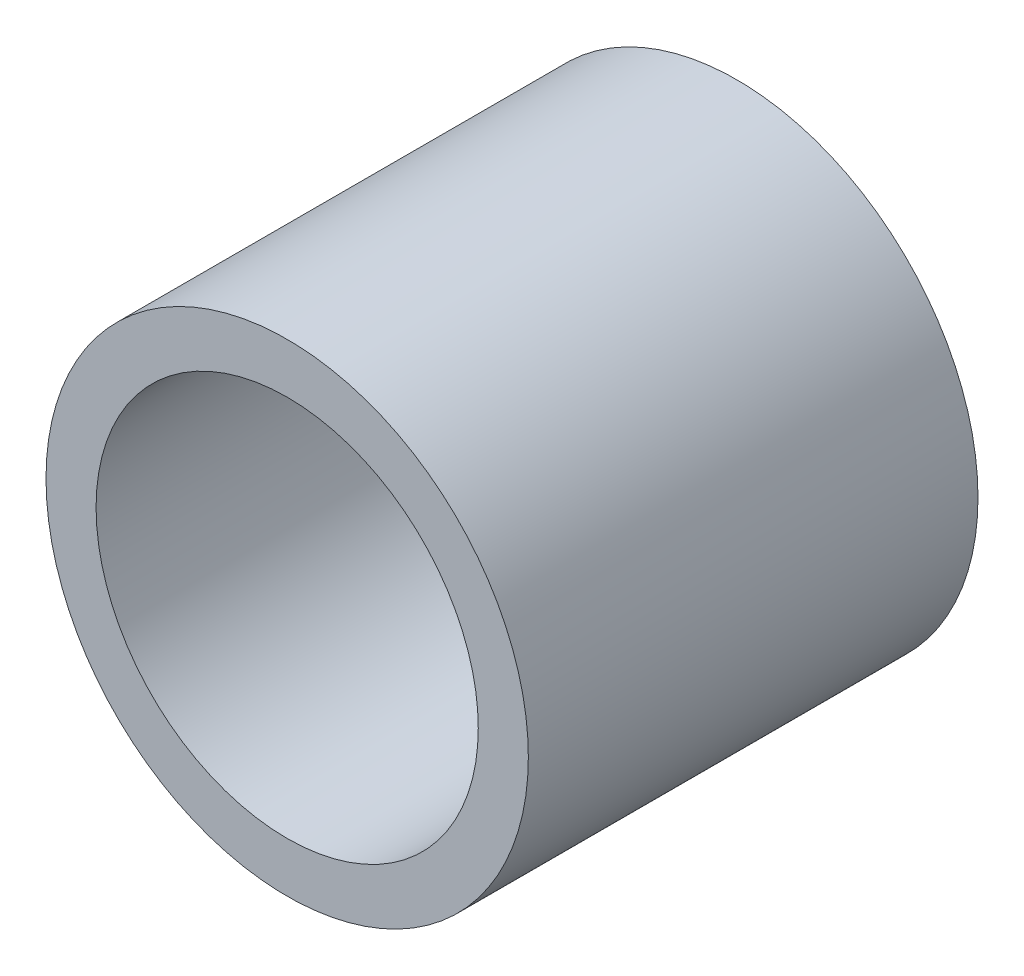
ISO-10303-21;
HEADER;
FILE_DESCRIPTION(('STEP AP214'),'2;1');
FILE_NAME('part.step','',(''),(''),'','','');
FILE_SCHEMA(('AUTOMOTIVE_DESIGN { 1 0 10303 214 1 1 1 1 }'));
ENDSEC;
DATA;
#1=APPLICATION_CONTEXT('core data for automotive mechanical design processes');
#2=APPLICATION_PROTOCOL_DEFINITION('international standard','automotive_design',2000,#1);
#3=PRODUCT_CONTEXT('',#1,'mechanical');
#4=PRODUCT('Part','Part','',(#3));
#5=PRODUCT_RELATED_PRODUCT_CATEGORY('part','',(#4));
#6=PRODUCT_DEFINITION_FORMATION('','',#4);
#7=PRODUCT_DEFINITION_CONTEXT('part definition',#1,'design');
#8=PRODUCT_DEFINITION('design','',#6,#7);
#9=PRODUCT_DEFINITION_SHAPE('','',#8);
#10=(LENGTH_UNIT() NAMED_UNIT(*) SI_UNIT(.MILLI.,.METRE.));
#11=(NAMED_UNIT(*) PLANE_ANGLE_UNIT() SI_UNIT($,.RADIAN.));
#12=(NAMED_UNIT(*) SI_UNIT($,.STERADIAN.) SOLID_ANGLE_UNIT());
#13=UNCERTAINTY_MEASURE_WITH_UNIT(LENGTH_MEASURE(1.E-05),#10,'distance_accuracy_value','');
#14=(GEOMETRIC_REPRESENTATION_CONTEXT(3) GLOBAL_UNCERTAINTY_ASSIGNED_CONTEXT((#13)) GLOBAL_UNIT_ASSIGNED_CONTEXT((#10,
#11,#12)) REPRESENTATION_CONTEXT('',''));
#15=CARTESIAN_POINT('',(0.,0.,0.));
#16=DIRECTION('',(0.,0.,1.));
#17=DIRECTION('',(1.,0.,0.));
#18=AXIS2_PLACEMENT_3D('',#15,#16,#17);
#19=CARTESIAN_POINT('',(0.,0.,30.988));
#20=DIRECTION('',(0.,0.,-1.));
#21=DIRECTION('',(-1.,0.,0.));
#22=AXIS2_PLACEMENT_3D('',#19,#20,#21);
#23=CYLINDRICAL_SURFACE('',#22,14.986);
#24=CARTESIAN_POINT('',(0.,0.,0.));
#25=DIRECTION('',(0.,0.,1.));
#26=DIRECTION('',(1.,0.,0.));
#27=AXIS2_PLACEMENT_3D('',#24,#25,#26);
#28=CIRCLE('',#27,14.986);
#29=CARTESIAN_POINT('',(14.986,0.,0.));
#30=VERTEX_POINT('',#29);
#31=EDGE_CURVE('E10',#30,#30,#28,.T.);
#32=ORIENTED_EDGE('',*,*,#31,.T.);
#33=EDGE_LOOP('',(#32));
#34=FACE_BOUND('',#33,.T.);
#35=CARTESIAN_POINT('',(0.,0.,27.94));
#36=DIRECTION('',(0.,0.,1.));
#37=DIRECTION('',(1.,0.,0.));
#38=AXIS2_PLACEMENT_3D('',#35,#36,#37);
#39=CIRCLE('',#38,14.986);
#40=CARTESIAN_POINT('',(14.986,0.,27.94));
#41=VERTEX_POINT('',#40);
#42=EDGE_CURVE('E47',#41,#41,#39,.T.);
#43=ORIENTED_EDGE('',*,*,#42,.F.);
#44=EDGE_LOOP('',(#43));
#45=FACE_BOUND('',#44,.T.);
#46=ADVANCED_FACE('F37',(#34,#45),#23,.T.);
#47=CARTESIAN_POINT('',(0.,0.,0.));
#48=DIRECTION('',(0.,0.,1.));
#49=DIRECTION('',(1.,0.,0.));
#50=AXIS2_PLACEMENT_3D('',#47,#48,#49);
#51=PLANE('',#50);
#52=ORIENTED_EDGE('',*,*,#31,.F.);
#53=EDGE_LOOP('',(#52));
#54=FACE_BOUND('',#53,.T.);
#55=ADVANCED_FACE('F63',(#54),#51,.F.);
#56=CARTESIAN_POINT('',(0.,0.,27.94));
#57=DIRECTION('',(0.,0.,1.));
#58=DIRECTION('',(1.,0.,0.));
#59=AXIS2_PLACEMENT_3D('',#56,#57,#58);
#60=PLANE('',#59);
#61=CARTESIAN_POINT('',(0.,0.,27.94));
#62=DIRECTION('',(0.,0.,1.));
#63=DIRECTION('',(1.,0.,0.));
#64=AXIS2_PLACEMENT_3D('',#61,#62,#63);
#65=CIRCLE('',#64,11.8745);
#66=CARTESIAN_POINT('',(11.8745,0.,27.94));
#67=VERTEX_POINT('',#66);
#68=EDGE_CURVE('E51',#67,#67,#65,.T.);
#69=ORIENTED_EDGE('',*,*,#68,.F.);
#70=EDGE_LOOP('',(#69));
#71=FACE_BOUND('',#70,.T.);
#72=ORIENTED_EDGE('',*,*,#42,.T.);
#73=EDGE_LOOP('',(#72));
#74=FACE_BOUND('',#73,.T.);
#75=ADVANCED_FACE('F59',(#71,#74),#60,.T.);
#76=CARTESIAN_POINT('',(0.,0.,1.9558));
#77=DIRECTION('',(0.,0.,1.));
#78=DIRECTION('',(1.,0.,0.));
#79=AXIS2_PLACEMENT_3D('',#76,#77,#78);
#80=PLANE('',#79);
#81=CARTESIAN_POINT('',(0.,0.,1.9558));
#82=DIRECTION('',(0.,0.,1.));
#83=DIRECTION('',(1.,0.,0.));
#84=AXIS2_PLACEMENT_3D('',#81,#82,#83);
#85=CIRCLE('',#84,11.8745);
#86=CARTESIAN_POINT('',(11.8745,0.,1.9558));
#87=VERTEX_POINT('',#86);
#88=EDGE_CURVE('E43',#87,#87,#85,.T.);
#89=ORIENTED_EDGE('',*,*,#88,.T.);
#90=EDGE_LOOP('',(#89));
#91=FACE_BOUND('',#90,.T.);
#92=ADVANCED_FACE('F62',(#91),#80,.T.);
#93=CARTESIAN_POINT('',(0.,0.,1.9558));
#94=DIRECTION('',(0.,0.,1.));
#95=DIRECTION('',(1.,0.,0.));
#96=AXIS2_PLACEMENT_3D('',#93,#94,#95);
#97=CYLINDRICAL_SURFACE('',#96,11.8745);
#98=CARTESIAN_POINT('',(11.8745,0.,1.9558));
#99=CARTESIAN_POINT('',(11.8745,0.,2.22646875));
#100=CARTESIAN_POINT('',(11.8745,0.,2.4971375));
#101=CARTESIAN_POINT('',(11.8745,0.,3.038475));
#102=CARTESIAN_POINT('',(11.8745,0.,3.30914375));
#103=CARTESIAN_POINT('',(11.8745,0.,3.85048125));
#104=CARTESIAN_POINT('',(11.8745,0.,4.12115));
#105=CARTESIAN_POINT('',(11.8745,0.,4.6624875));
#106=CARTESIAN_POINT('',(11.8745,0.,4.93315625));
#107=CARTESIAN_POINT('',(11.8745,0.,5.47449375));
#108=CARTESIAN_POINT('',(11.8745,0.,5.7451625));
#109=CARTESIAN_POINT('',(11.8745,0.,6.2865));
#110=CARTESIAN_POINT('',(11.8745,0.,6.55716875));
#111=CARTESIAN_POINT('',(11.8745,0.,7.09850625));
#112=CARTESIAN_POINT('',(11.8745,0.,7.369175));
#113=CARTESIAN_POINT('',(11.8745,0.,7.9105125));
#114=CARTESIAN_POINT('',(11.8745,0.,8.18118125));
#115=CARTESIAN_POINT('',(11.8745,0.,8.72251875));
#116=CARTESIAN_POINT('',(11.8745,0.,8.9931875));
#117=CARTESIAN_POINT('',(11.8745,0.,9.534525));
#118=CARTESIAN_POINT('',(11.8745,0.,9.80519375));
#119=CARTESIAN_POINT('',(11.8745,0.,10.34653125));
#120=CARTESIAN_POINT('',(11.8745,0.,10.6172));
#121=CARTESIAN_POINT('',(11.8745,0.,11.1585375));
#122=CARTESIAN_POINT('',(11.8745,0.,11.42920625));
#123=CARTESIAN_POINT('',(11.8745,0.,11.97054375));
#124=CARTESIAN_POINT('',(11.8745,0.,12.2412125));
#125=CARTESIAN_POINT('',(11.8745,0.,12.78255));
#126=CARTESIAN_POINT('',(11.8745,0.,13.05321875));
#127=CARTESIAN_POINT('',(11.8745,0.,13.59455625));
#128=CARTESIAN_POINT('',(11.8745,0.,13.865225));
#129=CARTESIAN_POINT('',(11.8745,0.,14.4065625));
#130=CARTESIAN_POINT('',(11.8745,0.,14.67723125));
#131=CARTESIAN_POINT('',(11.8745,0.,15.21856875));
#132=CARTESIAN_POINT('',(11.8745,0.,15.4892375));
#133=CARTESIAN_POINT('',(11.8745,0.,16.030575));
#134=CARTESIAN_POINT('',(11.8745,0.,16.30124375));
#135=CARTESIAN_POINT('',(11.8745,0.,16.84258125));
#136=CARTESIAN_POINT('',(11.8745,0.,17.11325));
#137=CARTESIAN_POINT('',(11.8745,0.,17.6545875));
#138=CARTESIAN_POINT('',(11.8745,0.,17.92525625));
#139=CARTESIAN_POINT('',(11.8745,0.,18.46659375));
#140=CARTESIAN_POINT('',(11.8745,0.,18.7372625));
#141=CARTESIAN_POINT('',(11.8745,0.,19.2786));
#142=CARTESIAN_POINT('',(11.8745,0.,19.54926875));
#143=CARTESIAN_POINT('',(11.8745,0.,20.09060625));
#144=CARTESIAN_POINT('',(11.8745,0.,20.361275));
#145=CARTESIAN_POINT('',(11.8745,0.,20.9026125));
#146=CARTESIAN_POINT('',(11.8745,0.,21.17328125));
#147=CARTESIAN_POINT('',(11.8745,0.,21.71461875));
#148=CARTESIAN_POINT('',(11.8745,0.,21.9852875));
#149=CARTESIAN_POINT('',(11.8745,0.,22.526625));
#150=CARTESIAN_POINT('',(11.8745,0.,22.79729375));
#151=CARTESIAN_POINT('',(11.8745,0.,23.33863125));
#152=CARTESIAN_POINT('',(11.8745,0.,23.6093));
#153=CARTESIAN_POINT('',(11.8745,0.,24.1506375));
#154=CARTESIAN_POINT('',(11.8745,0.,24.42130625));
#155=CARTESIAN_POINT('',(11.8745,0.,24.96264375));
#156=CARTESIAN_POINT('',(11.8745,0.,25.2333125));
#157=CARTESIAN_POINT('',(11.8745,0.,25.77465));
#158=CARTESIAN_POINT('',(11.8745,0.,26.04531875));
#159=CARTESIAN_POINT('',(11.8745,0.,26.58665625));
#160=CARTESIAN_POINT('',(11.8745,0.,26.857325));
#161=CARTESIAN_POINT('',(11.8745,0.,27.3986625));
#162=CARTESIAN_POINT('',(11.8745,0.,27.66933125));
#163=CARTESIAN_POINT('',(11.8745,0.,27.94));
#164=B_SPLINE_CURVE_WITH_KNOTS('',3,(#98,#99,#100,#101,#102,#103,#104,#105,#106,#107,#108,#109,
#110,#111,#112,#113,#114,#115,#116,#117,#118,#119,#120,#121,#122,#123,#124,#125,#126,#127,#128,
#129,#130,#131,#132,#133,#134,#135,#136,#137,#138,#139,#140,#141,#142,#143,#144,#145,#146,#147,
#148,#149,#150,#151,#152,#153,#154,#155,#156,#157,#158,#159,#160,#161,#162,#163),.UNSPECIFIED.,
.F.,.F.,(4,2,2,2,2,2,2,2,2,2,2,2,2,2,2,2,2,2,2,2,2,2,2,2,2,2,2,2,2,2,2,2,4),(0.,0.81200625,
1.6240125,2.43601875,3.248025,4.06003125,4.8720375,5.68404375,6.49605,7.30805625,8.1200625,
8.93206875,9.744075,10.55608125,11.3680875,12.18009375,12.9921,13.80410625,14.6161125,
15.42811875,16.240125,17.05213125,17.8641375,18.67614375,19.48815,20.30015625,21.1121625,
21.92416875,22.736175,23.54818125,24.3601875,25.17219375,25.9842),.UNSPECIFIED.);
#165=EDGE_CURVE('BSEAM57',#87,#67,#164,.T.);
#166=ORIENTED_EDGE('',*,*,#88,.F.);
#167=ORIENTED_EDGE('',*,*,#68,.T.);
#168=ORIENTED_EDGE('',*,*,#165,.T.);
#169=ORIENTED_EDGE('',*,*,#165,.F.);
#170=EDGE_LOOP('',(#166,#168,#167,#169));
#171=FACE_BOUND('',#170,.T.);
#172=ADVANCED_FACE('F57',(#171),#97,.F.);
#173=CLOSED_SHELL('',(#46,#55,#75,#92,#172));
#174=MANIFOLD_SOLID_BREP('B2',#173);
#175=ADVANCED_BREP_SHAPE_REPRESENTATION('',(#18,#174),#14);
#176=SHAPE_DEFINITION_REPRESENTATION(#9,#175);
ENDSEC;
END-ISO-10303-21;
